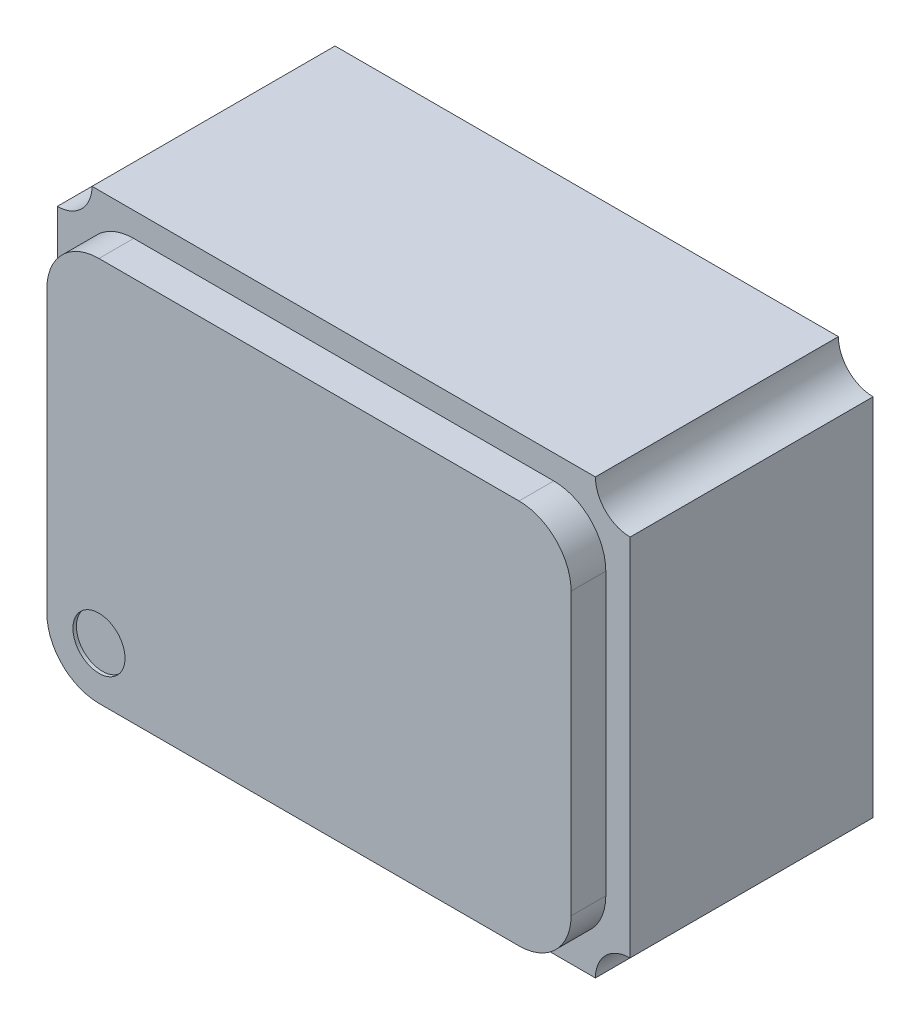
ISO-10303-21;
HEADER;
FILE_DESCRIPTION(('STEP AP214'),'2;1');
FILE_NAME('part.step','',(''),(''),'','','');
FILE_SCHEMA(('AUTOMOTIVE_DESIGN { 1 0 10303 214 1 1 1 1 }'));
ENDSEC;
DATA;
#1=APPLICATION_CONTEXT('core data for automotive mechanical design processes');
#2=APPLICATION_PROTOCOL_DEFINITION('international standard','automotive_design',2000,#1);
#3=PRODUCT_CONTEXT('',#1,'mechanical');
#4=PRODUCT('Part','Part','',(#3));
#5=PRODUCT_RELATED_PRODUCT_CATEGORY('part','',(#4));
#6=PRODUCT_DEFINITION_FORMATION('','',#4);
#7=PRODUCT_DEFINITION_CONTEXT('part definition',#1,'design');
#8=PRODUCT_DEFINITION('design','',#6,#7);
#9=PRODUCT_DEFINITION_SHAPE('','',#8);
#10=(LENGTH_UNIT() NAMED_UNIT(*) SI_UNIT(.MILLI.,.METRE.));
#11=(NAMED_UNIT(*) PLANE_ANGLE_UNIT() SI_UNIT($,.RADIAN.));
#12=(NAMED_UNIT(*) SI_UNIT($,.STERADIAN.) SOLID_ANGLE_UNIT());
#13=UNCERTAINTY_MEASURE_WITH_UNIT(LENGTH_MEASURE(1.E-05),#10,'distance_accuracy_value','');
#14=(GEOMETRIC_REPRESENTATION_CONTEXT(3) GLOBAL_UNCERTAINTY_ASSIGNED_CONTEXT((#13)) GLOBAL_UNIT_ASSIGNED_CONTEXT((#10,
#11,#12)) REPRESENTATION_CONTEXT('',''));
#15=CARTESIAN_POINT('',(0.,0.,0.));
#16=DIRECTION('',(0.,0.,1.));
#17=DIRECTION('',(1.,0.,0.));
#18=AXIS2_PLACEMENT_3D('',#15,#16,#17);
#19=CARTESIAN_POINT('',(0.825,0.625,0.7));
#20=DIRECTION('',(-1.,0.,0.));
#21=DIRECTION('',(0.,-1.,0.));
#22=AXIS2_PLACEMENT_3D('',#19,#20,#21);
#23=PLANE('',#22);
#24=DIRECTION('',(0.,1.,0.));
#25=VECTOR('',#24,1.);
#26=CARTESIAN_POINT('',(0.825,0.625,0.7));
#27=LINE('',#26,#25);
#28=CARTESIAN_POINT('',(0.825,-0.525,0.7));
#29=VERTEX_POINT('',#28);
#30=CARTESIAN_POINT('',(0.825,0.525,0.7));
#31=VERTEX_POINT('',#30);
#32=EDGE_CURVE('E189',#29,#31,#27,.T.);
#33=ORIENTED_EDGE('',*,*,#32,.F.);
#34=DIRECTION('',(0.,0.,1.));
#35=VECTOR('',#34,1.);
#36=CARTESIAN_POINT('',(0.825,-0.525,0.));
#37=LINE('',#36,#35);
#38=CARTESIAN_POINT('',(0.825,-0.525,0.));
#39=VERTEX_POINT('',#38);
#40=EDGE_CURVE('E323',#29,#39,#37,.F.);
#41=ORIENTED_EDGE('',*,*,#40,.T.);
#42=DIRECTION('',(0.,1.,0.));
#43=VECTOR('',#42,1.);
#44=CARTESIAN_POINT('',(0.825,0.625,0.));
#45=LINE('',#44,#43);
#46=CARTESIAN_POINT('',(0.825,0.525,0.));
#47=VERTEX_POINT('',#46);
#48=EDGE_CURVE('E191',#39,#47,#45,.T.);
#49=ORIENTED_EDGE('',*,*,#48,.T.);
#50=DIRECTION('',(0.,0.,1.));
#51=VECTOR('',#50,1.);
#52=CARTESIAN_POINT('',(0.825,0.525,0.));
#53=LINE('',#52,#51);
#54=EDGE_CURVE('E324',#47,#31,#53,.T.);
#55=ORIENTED_EDGE('',*,*,#54,.T.);
#56=EDGE_LOOP('',(#33,#41,#49,#55));
#57=FACE_BOUND('',#56,.T.);
#58=ADVANCED_FACE('F51',(#57),#23,.F.);
#59=CARTESIAN_POINT('',(-0.825,0.625,0.7));
#60=DIRECTION('',(0.,-1.,0.));
#61=DIRECTION('',(0.,0.,-1.));
#62=AXIS2_PLACEMENT_3D('',#59,#60,#61);
#63=PLANE('',#62);
#64=DIRECTION('',(-1.,0.,0.));
#65=VECTOR('',#64,1.);
#66=CARTESIAN_POINT('',(-0.825,0.625,0.7));
#67=LINE('',#66,#65);
#68=CARTESIAN_POINT('',(0.725,0.625,0.7));
#69=VERTEX_POINT('',#68);
#70=CARTESIAN_POINT('',(-0.725,0.625,0.7));
#71=VERTEX_POINT('',#70);
#72=EDGE_CURVE('E299',#69,#71,#67,.T.);
#73=ORIENTED_EDGE('',*,*,#72,.F.);
#74=DIRECTION('',(0.,0.,1.));
#75=VECTOR('',#74,1.);
#76=CARTESIAN_POINT('',(0.725,0.625,0.));
#77=LINE('',#76,#75);
#78=CARTESIAN_POINT('',(0.725,0.625,0.));
#79=VERTEX_POINT('',#78);
#80=EDGE_CURVE('E331',#69,#79,#77,.F.);
#81=ORIENTED_EDGE('',*,*,#80,.T.);
#82=DIRECTION('',(-1.,0.,0.));
#83=VECTOR('',#82,1.);
#84=CARTESIAN_POINT('',(-0.825,0.625,0.));
#85=LINE('',#84,#83);
#86=CARTESIAN_POINT('',(-0.725,0.625,0.));
#87=VERTEX_POINT('',#86);
#88=EDGE_CURVE('E184',#79,#87,#85,.T.);
#89=ORIENTED_EDGE('',*,*,#88,.T.);
#90=DIRECTION('',(0.,0.,1.));
#91=VECTOR('',#90,1.);
#92=CARTESIAN_POINT('',(-0.725,0.625,0.));
#93=LINE('',#92,#91);
#94=EDGE_CURVE('E67',#87,#71,#93,.T.);
#95=ORIENTED_EDGE('',*,*,#94,.T.);
#96=EDGE_LOOP('',(#73,#81,#89,#95));
#97=FACE_BOUND('',#96,.T.);
#98=ADVANCED_FACE('F368',(#97),#63,.F.);
#99=CARTESIAN_POINT('',(-0.825,0.625,0.7));
#100=DIRECTION('',(1.,0.,0.));
#101=DIRECTION('',(0.,1.,0.));
#102=AXIS2_PLACEMENT_3D('',#99,#100,#101);
#103=PLANE('',#102);
#104=DIRECTION('',(0.,-1.,0.));
#105=VECTOR('',#104,1.);
#106=CARTESIAN_POINT('',(-0.825,0.625,0.));
#107=LINE('',#106,#105);
#108=CARTESIAN_POINT('',(-0.825,0.525,0.));
#109=VERTEX_POINT('',#108);
#110=CARTESIAN_POINT('',(-0.825,-0.525,0.));
#111=VERTEX_POINT('',#110);
#112=EDGE_CURVE('E173',#109,#111,#107,.T.);
#113=ORIENTED_EDGE('',*,*,#112,.T.);
#114=DIRECTION('',(0.,0.,1.));
#115=VECTOR('',#114,1.);
#116=CARTESIAN_POINT('',(-0.825,-0.525,0.));
#117=LINE('',#116,#115);
#118=CARTESIAN_POINT('',(-0.825,-0.525,0.7));
#119=VERTEX_POINT('',#118);
#120=EDGE_CURVE('E74',#111,#119,#117,.T.);
#121=ORIENTED_EDGE('',*,*,#120,.T.);
#122=DIRECTION('',(0.,-1.,0.));
#123=VECTOR('',#122,1.);
#124=CARTESIAN_POINT('',(-0.825,0.625,0.7));
#125=LINE('',#124,#123);
#126=CARTESIAN_POINT('',(-0.825,0.525,0.7));
#127=VERTEX_POINT('',#126);
#128=EDGE_CURVE('E175',#127,#119,#125,.T.);
#129=ORIENTED_EDGE('',*,*,#128,.F.);
#130=DIRECTION('',(0.,0.,1.));
#131=VECTOR('',#130,1.);
#132=CARTESIAN_POINT('',(-0.825,0.525,0.));
#133=LINE('',#132,#131);
#134=EDGE_CURVE('E163',#127,#109,#133,.F.);
#135=ORIENTED_EDGE('',*,*,#134,.T.);
#136=EDGE_LOOP('',(#113,#121,#129,#135));
#137=FACE_BOUND('',#136,.T.);
#138=ADVANCED_FACE('F172',(#137),#103,.F.);
#139=CARTESIAN_POINT('',(-0.825,-0.625,0.7));
#140=DIRECTION('',(0.,1.,0.));
#141=DIRECTION('',(0.,0.,1.));
#142=AXIS2_PLACEMENT_3D('',#139,#140,#141);
#143=PLANE('',#142);
#144=DIRECTION('',(1.,0.,0.));
#145=VECTOR('',#144,1.);
#146=CARTESIAN_POINT('',(-0.825,-0.625,0.7));
#147=LINE('',#146,#145);
#148=CARTESIAN_POINT('',(-0.725,-0.625,0.7));
#149=VERTEX_POINT('',#148);
#150=CARTESIAN_POINT('',(0.725,-0.625,0.7));
#151=VERTEX_POINT('',#150);
#152=EDGE_CURVE('E199',#149,#151,#147,.T.);
#153=ORIENTED_EDGE('',*,*,#152,.F.);
#154=DIRECTION('',(0.,0.,1.));
#155=VECTOR('',#154,1.);
#156=CARTESIAN_POINT('',(-0.725,-0.625,0.));
#157=LINE('',#156,#155);
#158=CARTESIAN_POINT('',(-0.725,-0.625,0.));
#159=VERTEX_POINT('',#158);
#160=EDGE_CURVE('E318',#149,#159,#157,.F.);
#161=ORIENTED_EDGE('',*,*,#160,.T.);
#162=DIRECTION('',(1.,0.,0.));
#163=VECTOR('',#162,1.);
#164=CARTESIAN_POINT('',(-0.825,-0.625,0.));
#165=LINE('',#164,#163);
#166=CARTESIAN_POINT('',(0.725,-0.625,0.));
#167=VERTEX_POINT('',#166);
#168=EDGE_CURVE('E183',#159,#167,#165,.T.);
#169=ORIENTED_EDGE('',*,*,#168,.T.);
#170=DIRECTION('',(0.,0.,1.));
#171=VECTOR('',#170,1.);
#172=CARTESIAN_POINT('',(0.725,-0.625,0.));
#173=LINE('',#172,#171);
#174=EDGE_CURVE('E319',#167,#151,#173,.T.);
#175=ORIENTED_EDGE('',*,*,#174,.T.);
#176=EDGE_LOOP('',(#153,#161,#169,#175));
#177=FACE_BOUND('',#176,.T.);
#178=ADVANCED_FACE('F317',(#177),#143,.F.);
#179=CARTESIAN_POINT('',(0.,0.,0.7));
#180=DIRECTION('',(0.,0.,1.));
#181=DIRECTION('',(1.,0.,0.));
#182=AXIS2_PLACEMENT_3D('',#179,#180,#181);
#183=PLANE('',#182);
#184=CARTESIAN_POINT('',(-0.825,-0.625,0.7));
#185=DIRECTION('',(0.,0.,1.));
#186=DIRECTION('',(1.,0.,0.));
#187=AXIS2_PLACEMENT_3D('',#184,#185,#186);
#188=CIRCLE('',#187,0.1);
#189=EDGE_CURVE('E313',#149,#119,#188,.T.);
#190=ORIENTED_EDGE('',*,*,#189,.F.);
#191=ORIENTED_EDGE('',*,*,#152,.T.);
#192=CARTESIAN_POINT('',(0.825,-0.625,0.7));
#193=DIRECTION('',(0.,0.,1.));
#194=DIRECTION('',(1.,0.,0.));
#195=AXIS2_PLACEMENT_3D('',#192,#193,#194);
#196=CIRCLE('',#195,0.1);
#197=EDGE_CURVE('E311',#29,#151,#196,.T.);
#198=ORIENTED_EDGE('',*,*,#197,.F.);
#199=ORIENTED_EDGE('',*,*,#32,.T.);
#200=CARTESIAN_POINT('',(0.825,0.625,0.7));
#201=DIRECTION('',(0.,0.,1.));
#202=DIRECTION('',(1.,0.,0.));
#203=AXIS2_PLACEMENT_3D('',#200,#201,#202);
#204=CIRCLE('',#203,0.1);
#205=EDGE_CURVE('E606',#69,#31,#204,.T.);
#206=ORIENTED_EDGE('',*,*,#205,.F.);
#207=ORIENTED_EDGE('',*,*,#72,.T.);
#208=CARTESIAN_POINT('',(-0.825,0.625,0.7));
#209=DIRECTION('',(0.,0.,1.));
#210=DIRECTION('',(1.,0.,0.));
#211=AXIS2_PLACEMENT_3D('',#208,#209,#210);
#212=CIRCLE('',#211,0.1);
#213=EDGE_CURVE('E177',#127,#71,#212,.T.);
#214=ORIENTED_EDGE('',*,*,#213,.F.);
#215=ORIENTED_EDGE('',*,*,#128,.T.);
#216=EDGE_LOOP('',(#190,#191,#198,#199,#206,#207,#214,#215));
#217=FACE_BOUND('',#216,.T.);
#218=DIRECTION('',(0.,1.,0.));
#219=VECTOR('',#218,1.);
#220=CARTESIAN_POINT('',(0.755,0.555,0.7));
#221=LINE('',#220,#219);
#222=CARTESIAN_POINT('',(0.755,-0.405,0.7));
#223=VERTEX_POINT('',#222);
#224=CARTESIAN_POINT('',(0.755,0.405,0.7));
#225=VERTEX_POINT('',#224);
#226=EDGE_CURVE('E286',#223,#225,#221,.T.);
#227=ORIENTED_EDGE('',*,*,#226,.F.);
#228=CARTESIAN_POINT('',(0.605,-0.405,0.7));
#229=DIRECTION('',(0.,0.,1.));
#230=DIRECTION('',(1.,0.,0.));
#231=AXIS2_PLACEMENT_3D('',#228,#229,#230);
#232=CIRCLE('',#231,0.15);
#233=CARTESIAN_POINT('',(0.605,-0.555,0.7));
#234=VERTEX_POINT('',#233);
#235=EDGE_CURVE('E242',#223,#234,#232,.F.);
#236=ORIENTED_EDGE('',*,*,#235,.T.);
#237=DIRECTION('',(1.,0.,0.));
#238=VECTOR('',#237,1.);
#239=CARTESIAN_POINT('',(-0.755,-0.555,0.7));
#240=LINE('',#239,#238);
#241=CARTESIAN_POINT('',(-0.605,-0.555,0.7));
#242=VERTEX_POINT('',#241);
#243=EDGE_CURVE('E253',#242,#234,#240,.T.);
#244=ORIENTED_EDGE('',*,*,#243,.F.);
#245=CARTESIAN_POINT('',(-0.605,-0.405,0.7));
#246=DIRECTION('',(0.,0.,1.));
#247=DIRECTION('',(1.,0.,0.));
#248=AXIS2_PLACEMENT_3D('',#245,#246,#247);
#249=CIRCLE('',#248,0.15);
#250=CARTESIAN_POINT('',(-0.755,-0.405,0.7));
#251=VERTEX_POINT('',#250);
#252=EDGE_CURVE('E60',#242,#251,#249,.F.);
#253=ORIENTED_EDGE('',*,*,#252,.T.);
#254=DIRECTION('',(0.,-1.,0.));
#255=VECTOR('',#254,1.);
#256=CARTESIAN_POINT('',(-0.755,0.555,0.7));
#257=LINE('',#256,#255);
#258=CARTESIAN_POINT('',(-0.755,0.405,0.7));
#259=VERTEX_POINT('',#258);
#260=EDGE_CURVE('E251',#259,#251,#257,.T.);
#261=ORIENTED_EDGE('',*,*,#260,.F.);
#262=CARTESIAN_POINT('',(-0.605,0.405,0.7));
#263=DIRECTION('',(0.,0.,1.));
#264=DIRECTION('',(1.,0.,0.));
#265=AXIS2_PLACEMENT_3D('',#262,#263,#264);
#266=CIRCLE('',#265,0.15);
#267=CARTESIAN_POINT('',(-0.605,0.555,0.7));
#268=VERTEX_POINT('',#267);
#269=EDGE_CURVE('E236',#259,#268,#266,.F.);
#270=ORIENTED_EDGE('',*,*,#269,.T.);
#271=DIRECTION('',(-1.,0.,0.));
#272=VECTOR('',#271,1.);
#273=CARTESIAN_POINT('',(-0.755,0.555,0.7));
#274=LINE('',#273,#272);
#275=CARTESIAN_POINT('',(0.605,0.555,0.7));
#276=VERTEX_POINT('',#275);
#277=EDGE_CURVE('E263',#276,#268,#274,.T.);
#278=ORIENTED_EDGE('',*,*,#277,.F.);
#279=CARTESIAN_POINT('',(0.605,0.405,0.7));
#280=DIRECTION('',(0.,0.,1.));
#281=DIRECTION('',(1.,0.,0.));
#282=AXIS2_PLACEMENT_3D('',#279,#280,#281);
#283=CIRCLE('',#282,0.15);
#284=EDGE_CURVE('E239',#276,#225,#283,.F.);
#285=ORIENTED_EDGE('',*,*,#284,.T.);
#286=EDGE_LOOP('',(#227,#236,#244,#253,#261,#270,#278,#285));
#287=FACE_BOUND('',#286,.T.);
#288=ADVANCED_FACE('F250',(#217,#287),#183,.T.);
#289=CARTESIAN_POINT('',(0.,0.,0.));
#290=DIRECTION('',(0.,0.,1.));
#291=DIRECTION('',(1.,0.,0.));
#292=AXIS2_PLACEMENT_3D('',#289,#290,#291);
#293=PLANE('',#292);
#294=ORIENTED_EDGE('',*,*,#168,.F.);
#295=CARTESIAN_POINT('',(-0.825,-0.625,0.));
#296=DIRECTION('',(0.,0.,1.));
#297=DIRECTION('',(1.,0.,0.));
#298=AXIS2_PLACEMENT_3D('',#295,#296,#297);
#299=CIRCLE('',#298,0.1);
#300=EDGE_CURVE('E181',#159,#111,#299,.T.);
#301=ORIENTED_EDGE('',*,*,#300,.T.);
#302=ORIENTED_EDGE('',*,*,#112,.F.);
#303=CARTESIAN_POINT('',(-0.825,0.625,0.));
#304=DIRECTION('',(0.,0.,1.));
#305=DIRECTION('',(1.,0.,0.));
#306=AXIS2_PLACEMENT_3D('',#303,#304,#305);
#307=CIRCLE('',#306,0.1);
#308=EDGE_CURVE('E11',#109,#87,#307,.T.);
#309=ORIENTED_EDGE('',*,*,#308,.T.);
#310=ORIENTED_EDGE('',*,*,#88,.F.);
#311=CARTESIAN_POINT('',(0.825,0.625,0.));
#312=DIRECTION('',(0.,0.,1.));
#313=DIRECTION('',(1.,0.,0.));
#314=AXIS2_PLACEMENT_3D('',#311,#312,#313);
#315=CIRCLE('',#314,0.1);
#316=EDGE_CURVE('E609',#79,#47,#315,.T.);
#317=ORIENTED_EDGE('',*,*,#316,.T.);
#318=ORIENTED_EDGE('',*,*,#48,.F.);
#319=CARTESIAN_POINT('',(0.825,-0.625,0.));
#320=DIRECTION('',(0.,0.,1.));
#321=DIRECTION('',(1.,0.,0.));
#322=AXIS2_PLACEMENT_3D('',#319,#320,#321);
#323=CIRCLE('',#322,0.1);
#324=EDGE_CURVE('E615',#39,#167,#323,.T.);
#325=ORIENTED_EDGE('',*,*,#324,.T.);
#326=EDGE_LOOP('',(#294,#301,#302,#309,#310,#317,#318,#325));
#327=FACE_BOUND('',#326,.T.);
#328=ADVANCED_FACE('F180',(#327),#293,.F.);
#329=CARTESIAN_POINT('',(0.755,0.555,0.8));
#330=DIRECTION('',(-1.,0.,0.));
#331=DIRECTION('',(0.,0.,1.));
#332=AXIS2_PLACEMENT_3D('',#329,#330,#331);
#333=PLANE('',#332);
#334=ORIENTED_EDGE('',*,*,#226,.T.);
#335=DIRECTION('',(0.,0.,-1.));
#336=VECTOR('',#335,1.);
#337=CARTESIAN_POINT('',(0.755,0.405,0.8));
#338=LINE('',#337,#336);
#339=CARTESIAN_POINT('',(0.755,0.405,0.8));
#340=VERTEX_POINT('',#339);
#341=EDGE_CURVE('E226',#225,#340,#338,.F.);
#342=ORIENTED_EDGE('',*,*,#341,.T.);
#343=DIRECTION('',(0.,1.,0.));
#344=VECTOR('',#343,1.);
#345=CARTESIAN_POINT('',(0.755,0.555,0.8));
#346=LINE('',#345,#344);
#347=CARTESIAN_POINT('',(0.755,-0.405,0.8));
#348=VERTEX_POINT('',#347);
#349=EDGE_CURVE('E295',#348,#340,#346,.T.);
#350=ORIENTED_EDGE('',*,*,#349,.F.);
#351=DIRECTION('',(0.,0.,-1.));
#352=VECTOR('',#351,1.);
#353=CARTESIAN_POINT('',(0.755,-0.405,0.8));
#354=LINE('',#353,#352);
#355=EDGE_CURVE('E222',#348,#223,#354,.T.);
#356=ORIENTED_EDGE('',*,*,#355,.T.);
#357=EDGE_LOOP('',(#334,#342,#350,#356));
#358=FACE_BOUND('',#357,.T.);
#359=ADVANCED_FACE('F356',(#358),#333,.F.);
#360=CARTESIAN_POINT('',(-0.755,0.555,0.8));
#361=DIRECTION('',(0.,-1.,0.));
#362=DIRECTION('',(0.,0.,-1.));
#363=AXIS2_PLACEMENT_3D('',#360,#361,#362);
#364=PLANE('',#363);
#365=ORIENTED_EDGE('',*,*,#277,.T.);
#366=DIRECTION('',(0.,0.,-1.));
#367=VECTOR('',#366,1.);
#368=CARTESIAN_POINT('',(-0.605,0.555,0.8));
#369=LINE('',#368,#367);
#370=CARTESIAN_POINT('',(-0.605,0.555,0.8));
#371=VERTEX_POINT('',#370);
#372=EDGE_CURVE('E207',#268,#371,#369,.F.);
#373=ORIENTED_EDGE('',*,*,#372,.T.);
#374=DIRECTION('',(-1.,0.,0.));
#375=VECTOR('',#374,1.);
#376=CARTESIAN_POINT('',(-0.755,0.555,0.8));
#377=LINE('',#376,#375);
#378=CARTESIAN_POINT('',(0.605,0.555,0.8));
#379=VERTEX_POINT('',#378);
#380=EDGE_CURVE('E282',#379,#371,#377,.T.);
#381=ORIENTED_EDGE('',*,*,#380,.F.);
#382=DIRECTION('',(0.,0.,-1.));
#383=VECTOR('',#382,1.);
#384=CARTESIAN_POINT('',(0.605,0.555,0.8));
#385=LINE('',#384,#383);
#386=EDGE_CURVE('E203',#379,#276,#385,.T.);
#387=ORIENTED_EDGE('',*,*,#386,.T.);
#388=EDGE_LOOP('',(#365,#373,#381,#387));
#389=FACE_BOUND('',#388,.T.);
#390=ADVANCED_FACE('F351',(#389),#364,.F.);
#391=CARTESIAN_POINT('',(-0.755,0.555,0.8));
#392=DIRECTION('',(1.,0.,0.));
#393=DIRECTION('',(0.,0.,-1.));
#394=AXIS2_PLACEMENT_3D('',#391,#392,#393);
#395=PLANE('',#394);
#396=DIRECTION('',(0.,-1.,0.));
#397=VECTOR('',#396,1.);
#398=CARTESIAN_POINT('',(-0.755,0.555,0.8));
#399=LINE('',#398,#397);
#400=CARTESIAN_POINT('',(-0.755,0.405,0.8));
#401=VERTEX_POINT('',#400);
#402=CARTESIAN_POINT('',(-0.755,-0.405,0.8));
#403=VERTEX_POINT('',#402);
#404=EDGE_CURVE('E273',#401,#403,#399,.T.);
#405=ORIENTED_EDGE('',*,*,#404,.F.);
#406=DIRECTION('',(0.,0.,-1.));
#407=VECTOR('',#406,1.);
#408=CARTESIAN_POINT('',(-0.755,0.405,0.8));
#409=LINE('',#408,#407);
#410=EDGE_CURVE('E198',#401,#259,#409,.T.);
#411=ORIENTED_EDGE('',*,*,#410,.T.);
#412=ORIENTED_EDGE('',*,*,#260,.T.);
#413=DIRECTION('',(0.,0.,-1.));
#414=VECTOR('',#413,1.);
#415=CARTESIAN_POINT('',(-0.755,-0.405,0.8));
#416=LINE('',#415,#414);
#417=EDGE_CURVE('E195',#251,#403,#416,.F.);
#418=ORIENTED_EDGE('',*,*,#417,.T.);
#419=EDGE_LOOP('',(#405,#411,#412,#418));
#420=FACE_BOUND('',#419,.T.);
#421=ADVANCED_FACE('F259',(#420),#395,.F.);
#422=CARTESIAN_POINT('',(-0.755,-0.555,0.8));
#423=DIRECTION('',(0.,1.,0.));
#424=DIRECTION('',(0.,0.,1.));
#425=AXIS2_PLACEMENT_3D('',#422,#423,#424);
#426=PLANE('',#425);
#427=ORIENTED_EDGE('',*,*,#243,.T.);
#428=DIRECTION('',(0.,0.,-1.));
#429=VECTOR('',#428,1.);
#430=CARTESIAN_POINT('',(0.605,-0.555,0.8));
#431=LINE('',#430,#429);
#432=CARTESIAN_POINT('',(0.605,-0.555,0.8));
#433=VERTEX_POINT('',#432);
#434=EDGE_CURVE('E233',#234,#433,#431,.F.);
#435=ORIENTED_EDGE('',*,*,#434,.T.);
#436=DIRECTION('',(1.,0.,0.));
#437=VECTOR('',#436,1.);
#438=CARTESIAN_POINT('',(-0.755,-0.555,0.8));
#439=LINE('',#438,#437);
#440=CARTESIAN_POINT('',(-0.605,-0.555,0.8));
#441=VERTEX_POINT('',#440);
#442=EDGE_CURVE('E271',#441,#433,#439,.T.);
#443=ORIENTED_EDGE('',*,*,#442,.F.);
#444=DIRECTION('',(0.,0.,-1.));
#445=VECTOR('',#444,1.);
#446=CARTESIAN_POINT('',(-0.605,-0.555,0.8));
#447=LINE('',#446,#445);
#448=EDGE_CURVE('E229',#441,#242,#447,.T.);
#449=ORIENTED_EDGE('',*,*,#448,.T.);
#450=EDGE_LOOP('',(#427,#435,#443,#449));
#451=FACE_BOUND('',#450,.T.);
#452=ADVANCED_FACE('F275',(#451),#426,.F.);
#453=CARTESIAN_POINT('',(0.,0.,0.8));
#454=DIRECTION('',(0.,0.,1.));
#455=DIRECTION('',(1.,0.,0.));
#456=AXIS2_PLACEMENT_3D('',#453,#454,#455);
#457=PLANE('',#456);
#458=CARTESIAN_POINT('',(-0.605,-0.405,0.8));
#459=DIRECTION('',(0.,0.,1.));
#460=DIRECTION('',(1.,0.,0.));
#461=AXIS2_PLACEMENT_3D('',#458,#459,#460);
#462=CIRCLE('',#461,0.075);
#463=CARTESIAN_POINT('',(-0.53,-0.405,0.8));
#464=VERTEX_POINT('',#463);
#465=EDGE_CURVE('E598',#464,#464,#462,.T.);
#466=ORIENTED_EDGE('',*,*,#465,.F.);
#467=EDGE_LOOP('',(#466));
#468=FACE_BOUND('',#467,.T.);
#469=ORIENTED_EDGE('',*,*,#380,.T.);
#470=CARTESIAN_POINT('',(-0.605,0.405,0.8));
#471=DIRECTION('',(0.,0.,1.));
#472=DIRECTION('',(1.,0.,0.));
#473=AXIS2_PLACEMENT_3D('',#470,#471,#472);
#474=CIRCLE('',#473,0.15);
#475=EDGE_CURVE('E219',#371,#401,#474,.T.);
#476=ORIENTED_EDGE('',*,*,#475,.T.);
#477=ORIENTED_EDGE('',*,*,#404,.T.);
#478=CARTESIAN_POINT('',(-0.605,-0.405,0.8));
#479=DIRECTION('',(0.,0.,1.));
#480=DIRECTION('',(1.,0.,0.));
#481=AXIS2_PLACEMENT_3D('',#478,#479,#480);
#482=CIRCLE('',#481,0.15);
#483=EDGE_CURVE('E210',#403,#441,#482,.T.);
#484=ORIENTED_EDGE('',*,*,#483,.T.);
#485=ORIENTED_EDGE('',*,*,#442,.T.);
#486=CARTESIAN_POINT('',(0.605,-0.405,0.8));
#487=DIRECTION('',(0.,0.,1.));
#488=DIRECTION('',(1.,0.,0.));
#489=AXIS2_PLACEMENT_3D('',#486,#487,#488);
#490=CIRCLE('',#489,0.15);
#491=EDGE_CURVE('E213',#433,#348,#490,.T.);
#492=ORIENTED_EDGE('',*,*,#491,.T.);
#493=ORIENTED_EDGE('',*,*,#349,.T.);
#494=CARTESIAN_POINT('',(0.605,0.405,0.8));
#495=DIRECTION('',(0.,0.,1.));
#496=DIRECTION('',(1.,0.,0.));
#497=AXIS2_PLACEMENT_3D('',#494,#495,#496);
#498=CIRCLE('',#497,0.15);
#499=EDGE_CURVE('E216',#340,#379,#498,.T.);
#500=ORIENTED_EDGE('',*,*,#499,.T.);
#501=EDGE_LOOP('',(#469,#476,#477,#484,#485,#492,#493,#500));
#502=FACE_BOUND('',#501,.T.);
#503=ADVANCED_FACE('F270',(#468,#502),#457,.T.);
#504=CARTESIAN_POINT('',(-0.605,0.405,0.8));
#505=DIRECTION('',(0.,0.,-1.));
#506=DIRECTION('',(-1.,0.,0.));
#507=AXIS2_PLACEMENT_3D('',#504,#505,#506);
#508=CYLINDRICAL_SURFACE('',#507,0.15);
#509=ORIENTED_EDGE('',*,*,#475,.F.);
#510=ORIENTED_EDGE('',*,*,#372,.F.);
#511=ORIENTED_EDGE('',*,*,#269,.F.);
#512=ORIENTED_EDGE('',*,*,#410,.F.);
#513=EDGE_LOOP('',(#509,#510,#511,#512));
#514=FACE_BOUND('',#513,.T.);
#515=ADVANCED_FACE('F349',(#514),#508,.T.);
#516=CARTESIAN_POINT('',(0.605,0.405,0.8));
#517=DIRECTION('',(0.,0.,-1.));
#518=DIRECTION('',(-1.,0.,0.));
#519=AXIS2_PLACEMENT_3D('',#516,#517,#518);
#520=CYLINDRICAL_SURFACE('',#519,0.15);
#521=ORIENTED_EDGE('',*,*,#499,.F.);
#522=ORIENTED_EDGE('',*,*,#341,.F.);
#523=ORIENTED_EDGE('',*,*,#284,.F.);
#524=ORIENTED_EDGE('',*,*,#386,.F.);
#525=EDGE_LOOP('',(#521,#522,#523,#524));
#526=FACE_BOUND('',#525,.T.);
#527=ADVANCED_FACE('F353',(#526),#520,.T.);
#528=CARTESIAN_POINT('',(0.605,-0.405,0.8));
#529=DIRECTION('',(0.,0.,-1.));
#530=DIRECTION('',(-1.,0.,0.));
#531=AXIS2_PLACEMENT_3D('',#528,#529,#530);
#532=CYLINDRICAL_SURFACE('',#531,0.15);
#533=ORIENTED_EDGE('',*,*,#491,.F.);
#534=ORIENTED_EDGE('',*,*,#434,.F.);
#535=ORIENTED_EDGE('',*,*,#235,.F.);
#536=ORIENTED_EDGE('',*,*,#355,.F.);
#537=EDGE_LOOP('',(#533,#534,#535,#536));
#538=FACE_BOUND('',#537,.T.);
#539=ADVANCED_FACE('F360',(#538),#532,.T.);
#540=CARTESIAN_POINT('',(-0.605,-0.405,0.8));
#541=DIRECTION('',(0.,0.,-1.));
#542=DIRECTION('',(-1.,0.,0.));
#543=AXIS2_PLACEMENT_3D('',#540,#541,#542);
#544=CYLINDRICAL_SURFACE('',#543,0.15);
#545=ORIENTED_EDGE('',*,*,#483,.F.);
#546=ORIENTED_EDGE('',*,*,#417,.F.);
#547=ORIENTED_EDGE('',*,*,#252,.F.);
#548=ORIENTED_EDGE('',*,*,#448,.F.);
#549=EDGE_LOOP('',(#545,#546,#547,#548));
#550=FACE_BOUND('',#549,.T.);
#551=ADVANCED_FACE('F53',(#550),#544,.T.);
#552=CARTESIAN_POINT('',(-0.825,0.625,0.));
#553=DIRECTION('',(0.,0.,1.));
#554=DIRECTION('',(1.,0.,0.));
#555=AXIS2_PLACEMENT_3D('',#552,#553,#554);
#556=CYLINDRICAL_SURFACE('',#555,0.1);
#557=ORIENTED_EDGE('',*,*,#308,.F.);
#558=ORIENTED_EDGE('',*,*,#134,.F.);
#559=ORIENTED_EDGE('',*,*,#213,.T.);
#560=ORIENTED_EDGE('',*,*,#94,.F.);
#561=EDGE_LOOP('',(#557,#558,#559,#560));
#562=FACE_BOUND('',#561,.T.);
#563=ADVANCED_FACE('F162',(#562),#556,.F.);
#564=CARTESIAN_POINT('',(0.825,0.625,0.));
#565=DIRECTION('',(0.,0.,1.));
#566=DIRECTION('',(1.,0.,0.));
#567=AXIS2_PLACEMENT_3D('',#564,#565,#566);
#568=CYLINDRICAL_SURFACE('',#567,0.1);
#569=ORIENTED_EDGE('',*,*,#316,.F.);
#570=ORIENTED_EDGE('',*,*,#80,.F.);
#571=ORIENTED_EDGE('',*,*,#205,.T.);
#572=ORIENTED_EDGE('',*,*,#54,.F.);
#573=EDGE_LOOP('',(#569,#570,#571,#572));
#574=FACE_BOUND('',#573,.T.);
#575=ADVANCED_FACE('F432',(#574),#568,.F.);
#576=CARTESIAN_POINT('',(0.825,-0.625,0.));
#577=DIRECTION('',(0.,0.,1.));
#578=DIRECTION('',(1.,0.,0.));
#579=AXIS2_PLACEMENT_3D('',#576,#577,#578);
#580=CYLINDRICAL_SURFACE('',#579,0.1);
#581=ORIENTED_EDGE('',*,*,#197,.T.);
#582=ORIENTED_EDGE('',*,*,#174,.F.);
#583=ORIENTED_EDGE('',*,*,#324,.F.);
#584=ORIENTED_EDGE('',*,*,#40,.F.);
#585=EDGE_LOOP('',(#581,#582,#583,#584));
#586=FACE_BOUND('',#585,.T.);
#587=ADVANCED_FACE('F440',(#586),#580,.F.);
#588=CARTESIAN_POINT('',(-0.825,-0.625,0.));
#589=DIRECTION('',(0.,0.,1.));
#590=DIRECTION('',(1.,0.,0.));
#591=AXIS2_PLACEMENT_3D('',#588,#589,#590);
#592=CYLINDRICAL_SURFACE('',#591,0.1);
#593=ORIENTED_EDGE('',*,*,#300,.F.);
#594=ORIENTED_EDGE('',*,*,#160,.F.);
#595=ORIENTED_EDGE('',*,*,#189,.T.);
#596=ORIENTED_EDGE('',*,*,#120,.F.);
#597=EDGE_LOOP('',(#593,#594,#595,#596));
#598=FACE_BOUND('',#597,.T.);
#599=ADVANCED_FACE('F449',(#598),#592,.F.);
#600=CARTESIAN_POINT('',(-0.605,-0.405,0.79));
#601=DIRECTION('',(0.,0.,1.));
#602=DIRECTION('',(1.,0.,0.));
#603=AXIS2_PLACEMENT_3D('',#600,#601,#602);
#604=CYLINDRICAL_SURFACE('',#603,0.075);
#605=CARTESIAN_POINT('',(-0.605,-0.405,0.79));
#606=DIRECTION('',(0.,0.,1.));
#607=DIRECTION('',(1.,0.,0.));
#608=AXIS2_PLACEMENT_3D('',#605,#606,#607);
#609=CIRCLE('',#608,0.075);
#610=CARTESIAN_POINT('',(-0.53,-0.405,0.79));
#611=VERTEX_POINT('',#610);
#612=EDGE_CURVE('E596',#611,#611,#609,.T.);
#613=ORIENTED_EDGE('',*,*,#612,.F.);
#614=EDGE_LOOP('',(#613));
#615=FACE_BOUND('',#614,.T.);
#616=ORIENTED_EDGE('',*,*,#465,.T.);
#617=EDGE_LOOP('',(#616));
#618=FACE_BOUND('',#617,.T.);
#619=ADVANCED_FACE('F457',(#615,#618),#604,.F.);
#620=CARTESIAN_POINT('',(-0.605,-0.405,0.79));
#621=DIRECTION('',(0.,0.,1.));
#622=DIRECTION('',(1.,0.,0.));
#623=AXIS2_PLACEMENT_3D('',#620,#621,#622);
#624=PLANE('',#623);
#625=ORIENTED_EDGE('',*,*,#612,.T.);
#626=EDGE_LOOP('',(#625));
#627=FACE_BOUND('',#626,.T.);
#628=ADVANCED_FACE('F475',(#627),#624,.T.);
#629=CLOSED_SHELL('',(#58,#98,#138,#178,#288,#328,#359,#390,#421,#452,#503,#515,#527,#539,#551,
#563,#575,#587,#599,#619,#628));
#630=MANIFOLD_SOLID_BREP('B2',#629);
#631=ADVANCED_BREP_SHAPE_REPRESENTATION('',(#18,#630),#14);
#632=SHAPE_DEFINITION_REPRESENTATION(#9,#631);
ENDSEC;
END-ISO-10303-21;
